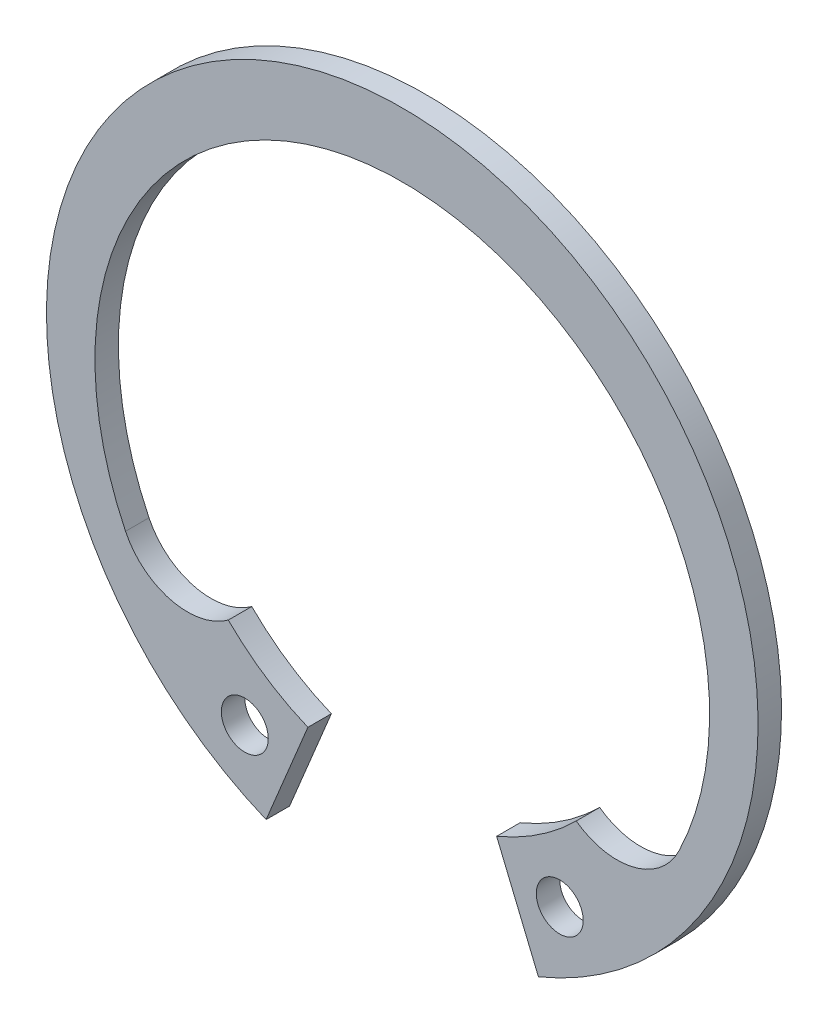
ISO-10303-21;
HEADER;
FILE_DESCRIPTION(('STEP AP214'),'2;1');
FILE_NAME('part.step','',(''),(''),'','','');
FILE_SCHEMA(('AUTOMOTIVE_DESIGN { 1 0 10303 214 1 1 1 1 }'));
ENDSEC;
DATA;
#1=APPLICATION_CONTEXT('core data for automotive mechanical design processes');
#2=APPLICATION_PROTOCOL_DEFINITION('international standard','automotive_design',2000,#1);
#3=PRODUCT_CONTEXT('',#1,'mechanical');
#4=PRODUCT('Part','Part','',(#3));
#5=PRODUCT_RELATED_PRODUCT_CATEGORY('part','',(#4));
#6=PRODUCT_DEFINITION_FORMATION('','',#4);
#7=PRODUCT_DEFINITION_CONTEXT('part definition',#1,'design');
#8=PRODUCT_DEFINITION('design','',#6,#7);
#9=PRODUCT_DEFINITION_SHAPE('','',#8);
#10=(LENGTH_UNIT() NAMED_UNIT(*) SI_UNIT(.MILLI.,.METRE.));
#11=(NAMED_UNIT(*) PLANE_ANGLE_UNIT() SI_UNIT($,.RADIAN.));
#12=(NAMED_UNIT(*) SI_UNIT($,.STERADIAN.) SOLID_ANGLE_UNIT());
#13=UNCERTAINTY_MEASURE_WITH_UNIT(LENGTH_MEASURE(1.E-05),#10,'distance_accuracy_value','');
#14=(GEOMETRIC_REPRESENTATION_CONTEXT(3) GLOBAL_UNCERTAINTY_ASSIGNED_CONTEXT((#13)) GLOBAL_UNIT_ASSIGNED_CONTEXT((#10,
#11,#12)) REPRESENTATION_CONTEXT('',''));
#15=CARTESIAN_POINT('',(0.,0.,0.));
#16=DIRECTION('',(0.,0.,1.));
#17=DIRECTION('',(1.,0.,0.));
#18=AXIS2_PLACEMENT_3D('',#15,#16,#17);
#19=CARTESIAN_POINT('',(0.,0.,-1.5));
#20=DIRECTION('',(0.,0.,1.));
#21=DIRECTION('',(1.,0.,0.));
#22=AXIS2_PLACEMENT_3D('',#19,#20,#21);
#23=CYLINDRICAL_SURFACE('',#22,22.75);
#24=CARTESIAN_POINT('',(0.,0.,0.));
#25=DIRECTION('',(0.,0.,1.));
#26=DIRECTION('',(1.,0.,0.));
#27=AXIS2_PLACEMENT_3D('',#24,#25,#26);
#28=CIRCLE('',#27,22.75);
#29=CARTESIAN_POINT('',(8.70604808630582,-21.0182593646318,0.));
#30=VERTEX_POINT('',#29);
#31=CARTESIAN_POINT('',(-8.70604808630581,-21.0182593646318,0.));
#32=VERTEX_POINT('',#31);
#33=EDGE_CURVE('E129',#30,#32,#28,.T.);
#34=ORIENTED_EDGE('',*,*,#33,.F.);
#35=DIRECTION('',(0.,0.,1.));
#36=VECTOR('',#35,1.);
#37=CARTESIAN_POINT('',(8.70604808630582,-21.0182593646318,-1.5));
#38=LINE('',#37,#36);
#39=CARTESIAN_POINT('',(8.70604808630582,-21.0182593646318,-1.5));
#40=VERTEX_POINT('',#39);
#41=EDGE_CURVE('E11',#40,#30,#38,.T.);
#42=ORIENTED_EDGE('',*,*,#41,.F.);
#43=CARTESIAN_POINT('',(0.,0.,-1.5));
#44=DIRECTION('',(0.,0.,1.));
#45=DIRECTION('',(1.,0.,0.));
#46=AXIS2_PLACEMENT_3D('',#43,#44,#45);
#47=CIRCLE('',#46,22.75);
#48=CARTESIAN_POINT('',(-8.70604808630581,-21.0182593646318,-1.5));
#49=VERTEX_POINT('',#48);
#50=EDGE_CURVE('E150',#40,#49,#47,.T.);
#51=ORIENTED_EDGE('',*,*,#50,.T.);
#52=DIRECTION('',(0.,0.,1.));
#53=VECTOR('',#52,1.);
#54=CARTESIAN_POINT('',(-8.70604808630581,-21.0182593646318,-1.5));
#55=LINE('',#54,#53);
#56=EDGE_CURVE('E35',#49,#32,#55,.T.);
#57=ORIENTED_EDGE('',*,*,#56,.T.);
#58=EDGE_LOOP('',(#34,#42,#51,#57));
#59=FACE_BOUND('',#58,.T.);
#60=ADVANCED_FACE('F32',(#59),#23,.T.);
#61=CARTESIAN_POINT('',(6.03491772839749,-14.569580227703,-1.5));
#62=DIRECTION('',(-0.923879532511286,-0.382683432365091,0.));
#63=DIRECTION('',(0.382683432365091,-0.923879532511286,0.));
#64=AXIS2_PLACEMENT_3D('',#61,#62,#63);
#65=PLANE('',#64);
#66=DIRECTION('',(0.382683432365091,-0.923879532511286,0.));
#67=VECTOR('',#66,1.);
#68=CARTESIAN_POINT('',(6.03491772839749,-14.569580227703,0.));
#69=LINE('',#68,#67);
#70=CARTESIAN_POINT('',(6.03491772839749,-14.569580227703,0.));
#71=VERTEX_POINT('',#70);
#72=EDGE_CURVE('E148',#71,#30,#69,.T.);
#73=ORIENTED_EDGE('',*,*,#72,.F.);
#74=DIRECTION('',(0.,0.,1.));
#75=VECTOR('',#74,1.);
#76=CARTESIAN_POINT('',(6.03491772839749,-14.569580227703,-1.5));
#77=LINE('',#76,#75);
#78=CARTESIAN_POINT('',(6.03491772839749,-14.569580227703,-1.5));
#79=VERTEX_POINT('',#78);
#80=EDGE_CURVE('E41',#79,#71,#77,.T.);
#81=ORIENTED_EDGE('',*,*,#80,.F.);
#82=DIRECTION('',(0.382683432365091,-0.923879532511286,0.));
#83=VECTOR('',#82,1.);
#84=CARTESIAN_POINT('',(6.03491772839749,-14.569580227703,-1.5));
#85=LINE('',#84,#83);
#86=EDGE_CURVE('E119',#79,#40,#85,.T.);
#87=ORIENTED_EDGE('',*,*,#86,.T.);
#88=ORIENTED_EDGE('',*,*,#41,.T.);
#89=EDGE_LOOP('',(#73,#81,#87,#88));
#90=FACE_BOUND('',#89,.T.);
#91=ADVANCED_FACE('F162',(#90),#65,.T.);
#92=CARTESIAN_POINT('',(0.,0.,-1.5));
#93=DIRECTION('',(0.,0.,1.));
#94=DIRECTION('',(1.,0.,0.));
#95=AXIS2_PLACEMENT_3D('',#92,#93,#94);
#96=CYLINDRICAL_SURFACE('',#95,15.77);
#97=CARTESIAN_POINT('',(0.,0.,0.));
#98=DIRECTION('',(0.,0.,-1.));
#99=DIRECTION('',(-1.,0.,0.));
#100=AXIS2_PLACEMENT_3D('',#97,#98,#99);
#101=CIRCLE('',#100,15.77);
#102=CARTESIAN_POINT('',(11.1243303259637,-11.1777535667434,0.));
#103=VERTEX_POINT('',#102);
#104=EDGE_CURVE('E106',#103,#71,#101,.T.);
#105=ORIENTED_EDGE('',*,*,#104,.F.);
#106=DIRECTION('',(0.,0.,1.));
#107=VECTOR('',#106,1.);
#108=CARTESIAN_POINT('',(11.1243303259637,-11.1777535667434,-1.5));
#109=LINE('',#108,#107);
#110=CARTESIAN_POINT('',(11.1243303259637,-11.1777535667434,-1.5));
#111=VERTEX_POINT('',#110);
#112=EDGE_CURVE('E101',#111,#103,#109,.T.);
#113=ORIENTED_EDGE('',*,*,#112,.F.);
#114=CARTESIAN_POINT('',(0.,0.,-1.5));
#115=DIRECTION('',(0.,0.,-1.));
#116=DIRECTION('',(-1.,0.,0.));
#117=AXIS2_PLACEMENT_3D('',#114,#115,#116);
#118=CIRCLE('',#117,15.77);
#119=EDGE_CURVE('E104',#111,#79,#118,.T.);
#120=ORIENTED_EDGE('',*,*,#119,.T.);
#121=ORIENTED_EDGE('',*,*,#80,.T.);
#122=EDGE_LOOP('',(#105,#113,#120,#121));
#123=FACE_BOUND('',#122,.T.);
#124=ADVANCED_FACE('F103',(#123),#96,.F.);
#125=CARTESIAN_POINT('',(13.7316835332452,-7.63350339886876,-1.5));
#126=DIRECTION('',(0.,0.,1.));
#127=DIRECTION('',(1.,0.,0.));
#128=AXIS2_PLACEMENT_3D('',#125,#126,#127);
#129=CYLINDRICAL_SURFACE('',#128,4.4);
#130=CARTESIAN_POINT('',(13.7316835332452,-7.63350339886876,0.));
#131=DIRECTION('',(0.,0.,-1.));
#132=DIRECTION('',(-1.,0.,0.));
#133=AXIS2_PLACEMENT_3D('',#130,#131,#132);
#134=CIRCLE('',#133,4.4);
#135=CARTESIAN_POINT('',(17.6936118969356,-9.54743224837844,0.));
#136=VERTEX_POINT('',#135);
#137=EDGE_CURVE('E145',#136,#103,#134,.T.);
#138=ORIENTED_EDGE('',*,*,#137,.F.);
#139=DIRECTION('',(0.,0.,1.));
#140=VECTOR('',#139,1.);
#141=CARTESIAN_POINT('',(17.6936118969356,-9.54743224837844,-1.5));
#142=LINE('',#141,#140);
#143=CARTESIAN_POINT('',(17.6936118969356,-9.54743224837844,-1.5));
#144=VERTEX_POINT('',#143);
#145=EDGE_CURVE('E111',#144,#136,#142,.T.);
#146=ORIENTED_EDGE('',*,*,#145,.F.);
#147=CARTESIAN_POINT('',(13.7316835332452,-7.63350339886876,-1.5));
#148=DIRECTION('',(0.,0.,-1.));
#149=DIRECTION('',(-1.,0.,0.));
#150=AXIS2_PLACEMENT_3D('',#147,#148,#149);
#151=CIRCLE('',#150,4.4);
#152=EDGE_CURVE('E117',#144,#111,#151,.T.);
#153=ORIENTED_EDGE('',*,*,#152,.T.);
#154=ORIENTED_EDGE('',*,*,#112,.T.);
#155=EDGE_LOOP('',(#138,#146,#153,#154));
#156=FACE_BOUND('',#155,.T.);
#157=ADVANCED_FACE('F121',(#156),#129,.F.);
#158=CARTESIAN_POINT('',(0.,-1.,-1.5));
#159=DIRECTION('',(0.,0.,1.));
#160=DIRECTION('',(1.,0.,0.));
#161=AXIS2_PLACEMENT_3D('',#158,#159,#160);
#162=CYLINDRICAL_SURFACE('',#161,19.65);
#163=CARTESIAN_POINT('',(0.,-1.,0.));
#164=DIRECTION('',(0.,0.,-1.));
#165=DIRECTION('',(1.,0.,0.));
#166=AXIS2_PLACEMENT_3D('',#163,#164,#165);
#167=CIRCLE('',#166,19.65);
#168=CARTESIAN_POINT('',(-17.6936118969356,-9.54743224837844,0.));
#169=VERTEX_POINT('',#168);
#170=EDGE_CURVE('E142',#169,#136,#167,.T.);
#171=ORIENTED_EDGE('',*,*,#170,.F.);
#172=DIRECTION('',(0.,0.,1.));
#173=VECTOR('',#172,1.);
#174=CARTESIAN_POINT('',(-17.6936118969356,-9.54743224837844,-1.5));
#175=LINE('',#174,#173);
#176=CARTESIAN_POINT('',(-17.6936118969356,-9.54743224837844,-1.5));
#177=VERTEX_POINT('',#176);
#178=EDGE_CURVE('E154',#177,#169,#175,.T.);
#179=ORIENTED_EDGE('',*,*,#178,.F.);
#180=CARTESIAN_POINT('',(0.,-1.,-1.5));
#181=DIRECTION('',(0.,0.,-1.));
#182=DIRECTION('',(1.,0.,0.));
#183=AXIS2_PLACEMENT_3D('',#180,#181,#182);
#184=CIRCLE('',#183,19.65);
#185=EDGE_CURVE('E122',#177,#144,#184,.T.);
#186=ORIENTED_EDGE('',*,*,#185,.T.);
#187=ORIENTED_EDGE('',*,*,#145,.T.);
#188=EDGE_LOOP('',(#171,#179,#186,#187));
#189=FACE_BOUND('',#188,.T.);
#190=ADVANCED_FACE('F175',(#189),#162,.F.);
#191=CARTESIAN_POINT('',(-13.7316835332452,-7.63350339886876,-1.5));
#192=DIRECTION('',(0.,0.,1.));
#193=DIRECTION('',(1.,0.,0.));
#194=AXIS2_PLACEMENT_3D('',#191,#192,#193);
#195=CYLINDRICAL_SURFACE('',#194,4.4);
#196=CARTESIAN_POINT('',(-13.7316835332452,-7.63350339886876,0.));
#197=DIRECTION('',(0.,0.,-1.));
#198=DIRECTION('',(1.,0.,0.));
#199=AXIS2_PLACEMENT_3D('',#196,#197,#198);
#200=CIRCLE('',#199,4.4);
#201=CARTESIAN_POINT('',(-11.1243303259637,-11.1777535667434,0.));
#202=VERTEX_POINT('',#201);
#203=EDGE_CURVE('E139',#202,#169,#200,.T.);
#204=ORIENTED_EDGE('',*,*,#203,.F.);
#205=DIRECTION('',(0.,0.,1.));
#206=VECTOR('',#205,1.);
#207=CARTESIAN_POINT('',(-11.1243303259637,-11.1777535667434,-1.5));
#208=LINE('',#207,#206);
#209=CARTESIAN_POINT('',(-11.1243303259637,-11.1777535667434,-1.5));
#210=VERTEX_POINT('',#209);
#211=EDGE_CURVE('E156',#210,#202,#208,.T.);
#212=ORIENTED_EDGE('',*,*,#211,.F.);
#213=CARTESIAN_POINT('',(-13.7316835332452,-7.63350339886876,-1.5));
#214=DIRECTION('',(0.,0.,-1.));
#215=DIRECTION('',(1.,0.,0.));
#216=AXIS2_PLACEMENT_3D('',#213,#214,#215);
#217=CIRCLE('',#216,4.4);
#218=EDGE_CURVE('E124',#210,#177,#217,.T.);
#219=ORIENTED_EDGE('',*,*,#218,.T.);
#220=ORIENTED_EDGE('',*,*,#178,.T.);
#221=EDGE_LOOP('',(#204,#212,#219,#220));
#222=FACE_BOUND('',#221,.T.);
#223=ADVANCED_FACE('F178',(#222),#195,.F.);
#224=CARTESIAN_POINT('',(0.,0.,-1.5));
#225=DIRECTION('',(0.,0.,1.));
#226=DIRECTION('',(1.,0.,0.));
#227=AXIS2_PLACEMENT_3D('',#224,#225,#226);
#228=CYLINDRICAL_SURFACE('',#227,15.77);
#229=CARTESIAN_POINT('',(0.,0.,0.));
#230=DIRECTION('',(0.,0.,-1.));
#231=DIRECTION('',(1.,0.,0.));
#232=AXIS2_PLACEMENT_3D('',#229,#230,#231);
#233=CIRCLE('',#232,15.77);
#234=CARTESIAN_POINT('',(-6.03491772839748,-14.569580227703,0.));
#235=VERTEX_POINT('',#234);
#236=EDGE_CURVE('E136',#235,#202,#233,.T.);
#237=ORIENTED_EDGE('',*,*,#236,.F.);
#238=DIRECTION('',(0.,0.,1.));
#239=VECTOR('',#238,1.);
#240=CARTESIAN_POINT('',(-6.03491772839748,-14.569580227703,-1.5));
#241=LINE('',#240,#239);
#242=CARTESIAN_POINT('',(-6.03491772839748,-14.569580227703,-1.5));
#243=VERTEX_POINT('',#242);
#244=EDGE_CURVE('E157',#243,#235,#241,.T.);
#245=ORIENTED_EDGE('',*,*,#244,.F.);
#246=CARTESIAN_POINT('',(0.,0.,-1.5));
#247=DIRECTION('',(0.,0.,-1.));
#248=DIRECTION('',(1.,0.,0.));
#249=AXIS2_PLACEMENT_3D('',#246,#247,#248);
#250=CIRCLE('',#249,15.77);
#251=EDGE_CURVE('E224',#243,#210,#250,.T.);
#252=ORIENTED_EDGE('',*,*,#251,.T.);
#253=ORIENTED_EDGE('',*,*,#211,.T.);
#254=EDGE_LOOP('',(#237,#245,#252,#253));
#255=FACE_BOUND('',#254,.T.);
#256=ADVANCED_FACE('F182',(#255),#228,.F.);
#257=CARTESIAN_POINT('',(-6.03491772839748,-14.569580227703,-1.5));
#258=DIRECTION('',(0.923879532511287,-0.382683432365091,0.));
#259=DIRECTION('',(0.382683432365091,0.923879532511287,0.));
#260=AXIS2_PLACEMENT_3D('',#257,#258,#259);
#261=PLANE('',#260);
#262=DIRECTION('',(0.382683432365091,0.923879532511286,0.));
#263=VECTOR('',#262,1.);
#264=CARTESIAN_POINT('',(-6.03491772839748,-14.569580227703,0.));
#265=LINE('',#264,#263);
#266=EDGE_CURVE('E132',#32,#235,#265,.T.);
#267=ORIENTED_EDGE('',*,*,#266,.F.);
#268=ORIENTED_EDGE('',*,*,#56,.F.);
#269=DIRECTION('',(0.382683432365091,0.923879532511286,0.));
#270=VECTOR('',#269,1.);
#271=CARTESIAN_POINT('',(-6.03491772839748,-14.569580227703,-1.5));
#272=LINE('',#271,#270);
#273=EDGE_CURVE('E222',#49,#243,#272,.T.);
#274=ORIENTED_EDGE('',*,*,#273,.T.);
#275=ORIENTED_EDGE('',*,*,#244,.T.);
#276=EDGE_LOOP('',(#267,#268,#274,#275));
#277=FACE_BOUND('',#276,.T.);
#278=ADVANCED_FACE('F159',(#277),#261,.T.);
#279=CARTESIAN_POINT('',(0.,0.,-1.5));
#280=DIRECTION('',(0.,0.,1.));
#281=DIRECTION('',(1.,0.,0.));
#282=AXIS2_PLACEMENT_3D('',#279,#280,#281);
#283=PLANE('',#282);
#284=CARTESIAN_POINT('',(10.067656556205,-16.4660952100461,-1.5));
#285=DIRECTION('',(0.,0.,1.));
#286=DIRECTION('',(-1.,0.,0.));
#287=AXIS2_PLACEMENT_3D('',#284,#285,#286);
#288=CIRCLE('',#287,1.5);
#289=CARTESIAN_POINT('',(8.56765655620496,-16.4660952100461,-1.5));
#290=VERTEX_POINT('',#289);
#291=EDGE_CURVE('E209',#290,#290,#288,.T.);
#292=ORIENTED_EDGE('',*,*,#291,.T.);
#293=EDGE_LOOP('',(#292));
#294=FACE_BOUND('',#293,.T.);
#295=CARTESIAN_POINT('',(-10.067656556205,-16.4660952100461,-1.5));
#296=DIRECTION('',(0.,0.,1.));
#297=DIRECTION('',(1.,0.,0.));
#298=AXIS2_PLACEMENT_3D('',#295,#296,#297);
#299=CIRCLE('',#298,1.5);
#300=CARTESIAN_POINT('',(-8.56765655620496,-16.4660952100461,-1.5));
#301=VERTEX_POINT('',#300);
#302=EDGE_CURVE('E133',#301,#301,#299,.T.);
#303=ORIENTED_EDGE('',*,*,#302,.T.);
#304=EDGE_LOOP('',(#303));
#305=FACE_BOUND('',#304,.T.);
#306=ORIENTED_EDGE('',*,*,#50,.F.);
#307=ORIENTED_EDGE('',*,*,#86,.F.);
#308=ORIENTED_EDGE('',*,*,#119,.F.);
#309=ORIENTED_EDGE('',*,*,#152,.F.);
#310=ORIENTED_EDGE('',*,*,#185,.F.);
#311=ORIENTED_EDGE('',*,*,#218,.F.);
#312=ORIENTED_EDGE('',*,*,#251,.F.);
#313=ORIENTED_EDGE('',*,*,#273,.F.);
#314=EDGE_LOOP('',(#306,#307,#308,#309,#310,#311,#312,#313));
#315=FACE_BOUND('',#314,.T.);
#316=ADVANCED_FACE('F115',(#294,#305,#315),#283,.F.);
#317=CARTESIAN_POINT('',(0.,0.,0.));
#318=DIRECTION('',(0.,0.,1.));
#319=DIRECTION('',(1.,0.,0.));
#320=AXIS2_PLACEMENT_3D('',#317,#318,#319);
#321=PLANE('',#320);
#322=CARTESIAN_POINT('',(10.067656556205,-16.4660952100461,0.));
#323=DIRECTION('',(0.,0.,1.));
#324=DIRECTION('',(-1.,0.,0.));
#325=AXIS2_PLACEMENT_3D('',#322,#323,#324);
#326=CIRCLE('',#325,1.5);
#327=CARTESIAN_POINT('',(8.56765655620496,-16.4660952100461,0.));
#328=VERTEX_POINT('',#327);
#329=EDGE_CURVE('E212',#328,#328,#326,.T.);
#330=ORIENTED_EDGE('',*,*,#329,.F.);
#331=EDGE_LOOP('',(#330));
#332=FACE_BOUND('',#331,.T.);
#333=CARTESIAN_POINT('',(-10.067656556205,-16.4660952100461,0.));
#334=DIRECTION('',(0.,0.,1.));
#335=DIRECTION('',(1.,0.,0.));
#336=AXIS2_PLACEMENT_3D('',#333,#334,#335);
#337=CIRCLE('',#336,1.5);
#338=CARTESIAN_POINT('',(-8.56765655620496,-16.4660952100461,0.));
#339=VERTEX_POINT('',#338);
#340=EDGE_CURVE('E214',#339,#339,#337,.T.);
#341=ORIENTED_EDGE('',*,*,#340,.F.);
#342=EDGE_LOOP('',(#341));
#343=FACE_BOUND('',#342,.T.);
#344=ORIENTED_EDGE('',*,*,#33,.T.);
#345=ORIENTED_EDGE('',*,*,#266,.T.);
#346=ORIENTED_EDGE('',*,*,#236,.T.);
#347=ORIENTED_EDGE('',*,*,#203,.T.);
#348=ORIENTED_EDGE('',*,*,#170,.T.);
#349=ORIENTED_EDGE('',*,*,#137,.T.);
#350=ORIENTED_EDGE('',*,*,#104,.T.);
#351=ORIENTED_EDGE('',*,*,#72,.T.);
#352=EDGE_LOOP('',(#344,#345,#346,#347,#348,#349,#350,#351));
#353=FACE_BOUND('',#352,.T.);
#354=ADVANCED_FACE('F161',(#332,#343,#353),#321,.T.);
#355=CARTESIAN_POINT('',(-10.067656556205,-16.4660952100461,-1.5));
#356=DIRECTION('',(0.,0.,1.));
#357=DIRECTION('',(1.,0.,0.));
#358=AXIS2_PLACEMENT_3D('',#355,#356,#357);
#359=CYLINDRICAL_SURFACE('',#358,1.5);
#360=ORIENTED_EDGE('',*,*,#302,.F.);
#361=EDGE_LOOP('',(#360));
#362=FACE_BOUND('',#361,.T.);
#363=ORIENTED_EDGE('',*,*,#340,.T.);
#364=EDGE_LOOP('',(#363));
#365=FACE_BOUND('',#364,.T.);
#366=ADVANCED_FACE('F194',(#362,#365),#359,.F.);
#367=CARTESIAN_POINT('',(10.067656556205,-16.4660952100461,-1.5));
#368=DIRECTION('',(0.,0.,1.));
#369=DIRECTION('',(1.,0.,0.));
#370=AXIS2_PLACEMENT_3D('',#367,#368,#369);
#371=CYLINDRICAL_SURFACE('',#370,1.5);
#372=ORIENTED_EDGE('',*,*,#291,.F.);
#373=EDGE_LOOP('',(#372));
#374=FACE_BOUND('',#373,.T.);
#375=ORIENTED_EDGE('',*,*,#329,.T.);
#376=EDGE_LOOP('',(#375));
#377=FACE_BOUND('',#376,.T.);
#378=ADVANCED_FACE('F201',(#374,#377),#371,.F.);
#379=CLOSED_SHELL('',(#60,#91,#124,#157,#190,#223,#256,#278,#316,#354,#366,#378));
#380=MANIFOLD_SOLID_BREP('B2',#379);
#381=ADVANCED_BREP_SHAPE_REPRESENTATION('',(#18,#380),#14);
#382=SHAPE_DEFINITION_REPRESENTATION(#9,#381);
ENDSEC;
END-ISO-10303-21;
